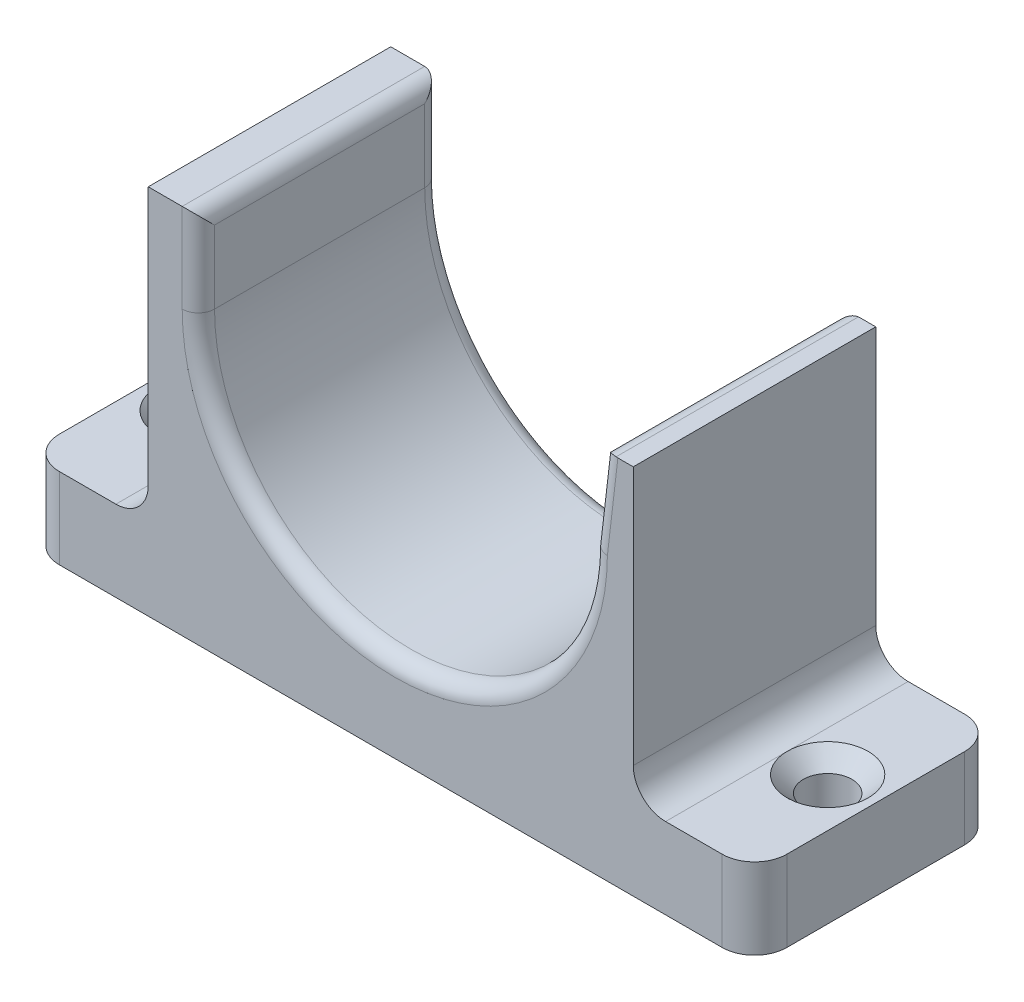
ISO-10303-21;
HEADER;
FILE_DESCRIPTION(('STEP AP214'),'2;1');
FILE_NAME('part.step','',(''),(''),'','','');
FILE_SCHEMA(('AUTOMOTIVE_DESIGN { 1 0 10303 214 1 1 1 1 }'));
ENDSEC;
DATA;
#1=APPLICATION_CONTEXT('core data for automotive mechanical design processes');
#2=APPLICATION_PROTOCOL_DEFINITION('international standard','automotive_design',2000,#1);
#3=PRODUCT_CONTEXT('',#1,'mechanical');
#4=PRODUCT('Part','Part','',(#3));
#5=PRODUCT_RELATED_PRODUCT_CATEGORY('part','',(#4));
#6=PRODUCT_DEFINITION_FORMATION('','',#4);
#7=PRODUCT_DEFINITION_CONTEXT('part definition',#1,'design');
#8=PRODUCT_DEFINITION('design','',#6,#7);
#9=PRODUCT_DEFINITION_SHAPE('','',#8);
#10=(LENGTH_UNIT() NAMED_UNIT(*) SI_UNIT(.MILLI.,.METRE.));
#11=(NAMED_UNIT(*) PLANE_ANGLE_UNIT() SI_UNIT($,.RADIAN.));
#12=(NAMED_UNIT(*) SI_UNIT($,.STERADIAN.) SOLID_ANGLE_UNIT());
#13=UNCERTAINTY_MEASURE_WITH_UNIT(LENGTH_MEASURE(1.E-05),#10,'distance_accuracy_value','');
#14=(GEOMETRIC_REPRESENTATION_CONTEXT(3) GLOBAL_UNCERTAINTY_ASSIGNED_CONTEXT((#13)) GLOBAL_UNIT_ASSIGNED_CONTEXT((#10,
#11,#12)) REPRESENTATION_CONTEXT('',''));
#15=CARTESIAN_POINT('',(0.,0.,0.));
#16=DIRECTION('',(0.,0.,1.));
#17=DIRECTION('',(1.,0.,0.));
#18=AXIS2_PLACEMENT_3D('',#15,#16,#17);
#19=CARTESIAN_POINT('',(22.7507170258644,17.5,-20.));
#20=DIRECTION('',(0.,0.,1.));
#21=DIRECTION('',(1.,0.,0.));
#22=AXIS2_PLACEMENT_3D('',#19,#20,#21);
#23=CYLINDRICAL_SURFACE('',#22,12.15);
#24=DIRECTION('',(0.,0.,1.));
#25=VECTOR('',#24,1.);
#26=CARTESIAN_POINT('',(10.6007170258644,17.5,-20.));
#27=LINE('',#26,#25);
#28=CARTESIAN_POINT('',(10.6007170258644,17.5,-1.));
#29=VERTEX_POINT('',#28);
#30=CARTESIAN_POINT('',(10.6007170258644,17.5,-14.));
#31=VERTEX_POINT('',#30);
#32=EDGE_CURVE('E331',#29,#31,#27,.F.);
#33=ORIENTED_EDGE('',*,*,#32,.F.);
#34=CARTESIAN_POINT('',(22.7507170258644,17.5,-1.));
#35=DIRECTION('',(0.,0.,-1.));
#36=DIRECTION('',(-1.,0.,0.));
#37=AXIS2_PLACEMENT_3D('',#34,#35,#36);
#38=CIRCLE('',#37,12.15);
#39=CARTESIAN_POINT('',(34.9007170258644,17.5000000000001,-1.));
#40=VERTEX_POINT('',#39);
#41=EDGE_CURVE('E338',#29,#40,#38,.F.);
#42=ORIENTED_EDGE('',*,*,#41,.T.);
#43=DIRECTION('',(0.,0.,1.));
#44=VECTOR('',#43,1.);
#45=CARTESIAN_POINT('',(34.9007170258644,17.5000000000001,-20.));
#46=LINE('',#45,#44);
#47=CARTESIAN_POINT('',(34.9007170258644,17.5000000000001,-14.));
#48=VERTEX_POINT('',#47);
#49=EDGE_CURVE('E333',#40,#48,#46,.F.);
#50=ORIENTED_EDGE('',*,*,#49,.T.);
#51=CARTESIAN_POINT('',(22.7507170258644,17.5,-14.));
#52=DIRECTION('',(0.,0.,1.));
#53=DIRECTION('',(1.,0.,0.));
#54=AXIS2_PLACEMENT_3D('',#51,#52,#53);
#55=CIRCLE('',#54,12.15);
#56=EDGE_CURVE('E336',#48,#31,#55,.F.);
#57=ORIENTED_EDGE('',*,*,#56,.T.);
#58=EDGE_LOOP('',(#33,#42,#50,#57));
#59=FACE_BOUND('',#58,.T.);
#60=ADVANCED_FACE('F39',(#59),#23,.F.);
#61=CARTESIAN_POINT('',(0.,23.,0.));
#62=DIRECTION('',(0.,1.,0.));
#63=DIRECTION('',(0.,0.,1.));
#64=AXIS2_PLACEMENT_3D('',#61,#62,#63);
#65=PLANE('',#64);
#66=DIRECTION('',(1.,0.,0.));
#67=VECTOR('',#66,1.);
#68=CARTESIAN_POINT('',(7.5,23.,0.));
#69=LINE('',#68,#67);
#70=CARTESIAN_POINT('',(7.5,23.,0.));
#71=VERTEX_POINT('',#70);
#72=CARTESIAN_POINT('',(9.60071702586444,23.,0.));
#73=VERTEX_POINT('',#72);
#74=EDGE_CURVE('E575',#71,#73,#69,.T.);
#75=ORIENTED_EDGE('',*,*,#74,.T.);
#76=DIRECTION('',(0.,0.,1.));
#77=VECTOR('',#76,1.);
#78=CARTESIAN_POINT('',(9.60071702586444,23.,-15.));
#79=LINE('',#78,#77);
#80=CARTESIAN_POINT('',(9.60071702586444,23.,-15.));
#81=VERTEX_POINT('',#80);
#82=EDGE_CURVE('E11',#73,#81,#79,.F.);
#83=ORIENTED_EDGE('',*,*,#82,.T.);
#84=DIRECTION('',(-1.,0.,0.));
#85=VECTOR('',#84,1.);
#86=CARTESIAN_POINT('',(37.5,23.,-15.));
#87=LINE('',#86,#85);
#88=CARTESIAN_POINT('',(7.5,23.,-15.));
#89=VERTEX_POINT('',#88);
#90=EDGE_CURVE('E199',#81,#89,#87,.T.);
#91=ORIENTED_EDGE('',*,*,#90,.T.);
#92=DIRECTION('',(0.,0.,1.));
#93=VECTOR('',#92,1.);
#94=CARTESIAN_POINT('',(7.5,23.,-15.));
#95=LINE('',#94,#93);
#96=EDGE_CURVE('E203',#89,#71,#95,.T.);
#97=ORIENTED_EDGE('',*,*,#96,.T.);
#98=EDGE_LOOP('',(#75,#83,#91,#97));
#99=FACE_BOUND('',#98,.T.);
#100=ADVANCED_FACE('F202',(#99),#65,.T.);
#101=CARTESIAN_POINT('',(0.,5.,0.));
#102=DIRECTION('',(0.,-1.,0.));
#103=DIRECTION('',(0.,0.,-1.));
#104=AXIS2_PLACEMENT_3D('',#101,#102,#103);
#105=PLANE('',#104);
#106=DIRECTION('',(0.,0.,-1.));
#107=VECTOR('',#106,1.);
#108=CARTESIAN_POINT('',(39.5,5.,0.));
#109=LINE('',#108,#107);
#110=CARTESIAN_POINT('',(39.5,5.,-15.));
#111=VERTEX_POINT('',#110);
#112=CARTESIAN_POINT('',(39.5,5.,-7.52482662311037));
#113=VERTEX_POINT('',#112);
#114=EDGE_CURVE('E266',#111,#113,#109,.F.);
#115=ORIENTED_EDGE('',*,*,#114,.T.);
#116=CARTESIAN_POINT('',(42.,5.,-7.52482662311037));
#117=DIRECTION('',(0.,-1.,0.));
#118=DIRECTION('',(0.,0.,-1.));
#119=AXIS2_PLACEMENT_3D('',#116,#117,#118);
#120=CIRCLE('',#119,2.5);
#121=EDGE_CURVE('E322',#113,#113,#120,.T.);
#122=ORIENTED_EDGE('',*,*,#121,.T.);
#123=CARTESIAN_POINT('',(39.5,5.,0.));
#124=VERTEX_POINT('',#123);
#125=EDGE_CURVE('E265',#113,#124,#109,.F.);
#126=ORIENTED_EDGE('',*,*,#125,.T.);
#127=DIRECTION('',(1.,0.,0.));
#128=VECTOR('',#127,1.);
#129=CARTESIAN_POINT('',(45.,5.,0.));
#130=LINE('',#129,#128);
#131=CARTESIAN_POINT('',(43.,5.,0.));
#132=VERTEX_POINT('',#131);
#133=EDGE_CURVE('E240',#124,#132,#130,.T.);
#134=ORIENTED_EDGE('',*,*,#133,.T.);
#135=CARTESIAN_POINT('',(43.,5.,-2.));
#136=DIRECTION('',(0.,-1.,0.));
#137=DIRECTION('',(0.,0.,-1.));
#138=AXIS2_PLACEMENT_3D('',#135,#136,#137);
#139=CIRCLE('',#138,2.);
#140=CARTESIAN_POINT('',(45.,5.,-2.));
#141=VERTEX_POINT('',#140);
#142=EDGE_CURVE('E261',#132,#141,#139,.F.);
#143=ORIENTED_EDGE('',*,*,#142,.T.);
#144=DIRECTION('',(0.,0.,-1.));
#145=VECTOR('',#144,1.);
#146=CARTESIAN_POINT('',(45.,5.,-15.));
#147=LINE('',#146,#145);
#148=CARTESIAN_POINT('',(45.,5.,-13.));
#149=VERTEX_POINT('',#148);
#150=EDGE_CURVE('E239',#141,#149,#147,.T.);
#151=ORIENTED_EDGE('',*,*,#150,.T.);
#152=CARTESIAN_POINT('',(43.,5.,-13.));
#153=DIRECTION('',(0.,-1.,0.));
#154=DIRECTION('',(0.,0.,-1.));
#155=AXIS2_PLACEMENT_3D('',#152,#153,#154);
#156=CIRCLE('',#155,2.);
#157=CARTESIAN_POINT('',(43.,5.,-15.));
#158=VERTEX_POINT('',#157);
#159=EDGE_CURVE('E263',#149,#158,#156,.F.);
#160=ORIENTED_EDGE('',*,*,#159,.T.);
#161=DIRECTION('',(-1.,0.,0.));
#162=VECTOR('',#161,1.);
#163=CARTESIAN_POINT('',(0.,5.,-15.));
#164=LINE('',#163,#162);
#165=EDGE_CURVE('E246',#158,#111,#164,.T.);
#166=ORIENTED_EDGE('',*,*,#165,.T.);
#167=EDGE_LOOP('',(#115,#122,#126,#134,#143,#151,#160,#166));
#168=FACE_BOUND('',#167,.T.);
#169=ADVANCED_FACE('F476',(#168),#105,.F.);
#170=DIRECTION('',(0.,0.,1.));
#171=VECTOR('',#170,1.);
#172=CARTESIAN_POINT('',(5.5,5.,-15.));
#173=LINE('',#172,#171);
#174=CARTESIAN_POINT('',(5.50000000000002,5.,0.));
#175=VERTEX_POINT('',#174);
#176=CARTESIAN_POINT('',(5.5,5.,-7.52482662311037));
#177=VERTEX_POINT('',#176);
#178=EDGE_CURVE('E298',#175,#177,#173,.F.);
#179=ORIENTED_EDGE('',*,*,#178,.T.);
#180=CARTESIAN_POINT('',(3.,5.,-7.52482662311037));
#181=DIRECTION('',(0.,-1.,0.));
#182=DIRECTION('',(0.,0.,-1.));
#183=AXIS2_PLACEMENT_3D('',#180,#181,#182);
#184=CIRCLE('',#183,2.5);
#185=EDGE_CURVE('E328',#177,#177,#184,.T.);
#186=ORIENTED_EDGE('',*,*,#185,.T.);
#187=CARTESIAN_POINT('',(5.5,5.,-15.));
#188=VERTEX_POINT('',#187);
#189=EDGE_CURVE('E297',#177,#188,#173,.F.);
#190=ORIENTED_EDGE('',*,*,#189,.T.);
#191=CARTESIAN_POINT('',(2.,5.,-15.));
#192=VERTEX_POINT('',#191);
#193=EDGE_CURVE('E243',#188,#192,#164,.T.);
#194=ORIENTED_EDGE('',*,*,#193,.T.);
#195=CARTESIAN_POINT('',(2.,5.,-13.));
#196=DIRECTION('',(0.,-1.,0.));
#197=DIRECTION('',(0.,0.,-1.));
#198=AXIS2_PLACEMENT_3D('',#195,#196,#197);
#199=CIRCLE('',#198,2.);
#200=CARTESIAN_POINT('',(0.,5.,-13.));
#201=VERTEX_POINT('',#200);
#202=EDGE_CURVE('E303',#192,#201,#199,.F.);
#203=ORIENTED_EDGE('',*,*,#202,.T.);
#204=DIRECTION('',(0.,0.,1.));
#205=VECTOR('',#204,1.);
#206=CARTESIAN_POINT('',(0.,5.,0.));
#207=LINE('',#206,#205);
#208=CARTESIAN_POINT('',(0.,5.,-2.));
#209=VERTEX_POINT('',#208);
#210=EDGE_CURVE('E247',#201,#209,#207,.T.);
#211=ORIENTED_EDGE('',*,*,#210,.T.);
#212=CARTESIAN_POINT('',(2.,5.,-2.));
#213=DIRECTION('',(0.,-1.,0.));
#214=DIRECTION('',(0.,0.,-1.));
#215=AXIS2_PLACEMENT_3D('',#212,#213,#214);
#216=CIRCLE('',#215,2.);
#217=CARTESIAN_POINT('',(2.00000000000002,5.,0.));
#218=VERTEX_POINT('',#217);
#219=EDGE_CURVE('E301',#209,#218,#216,.F.);
#220=ORIENTED_EDGE('',*,*,#219,.T.);
#221=EDGE_CURVE('E236',#218,#175,#130,.T.);
#222=ORIENTED_EDGE('',*,*,#221,.T.);
#223=EDGE_LOOP('',(#179,#186,#190,#194,#203,#211,#220,#222));
#224=FACE_BOUND('',#223,.T.);
#225=ADVANCED_FACE('F499',(#224),#105,.F.);
#226=CARTESIAN_POINT('',(45.,5.,0.));
#227=DIRECTION('',(0.,0.,-1.));
#228=DIRECTION('',(-1.,0.,0.));
#229=AXIS2_PLACEMENT_3D('',#226,#227,#228);
#230=PLANE('',#229);
#231=CARTESIAN_POINT('',(36.5490685316214,23.,0.));
#232=VERTEX_POINT('',#231);
#233=CARTESIAN_POINT('',(37.5,23.,0.));
#234=VERTEX_POINT('',#233);
#235=EDGE_CURVE('E221',#232,#234,#69,.T.);
#236=ORIENTED_EDGE('',*,*,#235,.F.);
#237=DIRECTION('',(0.115863649023973,0.993265128168129,0.));
#238=VECTOR('',#237,1.);
#239=CARTESIAN_POINT('',(34.5910172910963,6.21420020201986,0.));
#240=LINE('',#239,#238);
#241=CARTESIAN_POINT('',(35.9005834412089,17.4407272525104,0.));
#242=VERTEX_POINT('',#241);
#243=EDGE_CURVE('E346',#232,#242,#240,.F.);
#244=ORIENTED_EDGE('',*,*,#243,.T.);
#245=CARTESIAN_POINT('',(22.7507170258644,17.5,0.));
#246=DIRECTION('',(0.,0.,-1.));
#247=DIRECTION('',(-1.,0.,0.));
#248=AXIS2_PLACEMENT_3D('',#245,#246,#247);
#249=CIRCLE('',#248,13.15);
#250=CARTESIAN_POINT('',(9.60071702586444,17.5,0.));
#251=VERTEX_POINT('',#250);
#252=EDGE_CURVE('E343',#242,#251,#249,.T.);
#253=ORIENTED_EDGE('',*,*,#252,.T.);
#254=DIRECTION('',(0.,-1.,0.));
#255=VECTOR('',#254,1.);
#256=CARTESIAN_POINT('',(9.60071702586444,4.99999999999999,0.));
#257=LINE('',#256,#255);
#258=EDGE_CURVE('E341',#251,#73,#257,.F.);
#259=ORIENTED_EDGE('',*,*,#258,.T.);
#260=ORIENTED_EDGE('',*,*,#74,.F.);
#261=DIRECTION('',(0.,-1.,0.));
#262=VECTOR('',#261,1.);
#263=CARTESIAN_POINT('',(7.5,23.,0.));
#264=LINE('',#263,#262);
#265=CARTESIAN_POINT('',(7.5,7.,0.));
#266=VERTEX_POINT('',#265);
#267=EDGE_CURVE('E219',#71,#266,#264,.T.);
#268=ORIENTED_EDGE('',*,*,#267,.T.);
#269=CARTESIAN_POINT('',(5.5,7.,0.));
#270=DIRECTION('',(0.,0.,-1.));
#271=DIRECTION('',(-1.,0.,0.));
#272=AXIS2_PLACEMENT_3D('',#269,#270,#271);
#273=CIRCLE('',#272,2.);
#274=EDGE_CURVE('E311',#266,#175,#273,.T.);
#275=ORIENTED_EDGE('',*,*,#274,.T.);
#276=ORIENTED_EDGE('',*,*,#221,.F.);
#277=DIRECTION('',(0.,-1.,0.));
#278=VECTOR('',#277,1.);
#279=CARTESIAN_POINT('',(2.,5.,0.));
#280=LINE('',#279,#278);
#281=CARTESIAN_POINT('',(2.00000000000002,0.,0.));
#282=VERTEX_POINT('',#281);
#283=EDGE_CURVE('E287',#218,#282,#280,.T.);
#284=ORIENTED_EDGE('',*,*,#283,.T.);
#285=DIRECTION('',(1.,0.,0.));
#286=VECTOR('',#285,1.);
#287=CARTESIAN_POINT('',(45.,0.,0.));
#288=LINE('',#287,#286);
#289=CARTESIAN_POINT('',(43.,0.,0.));
#290=VERTEX_POINT('',#289);
#291=EDGE_CURVE('E227',#282,#290,#288,.T.);
#292=ORIENTED_EDGE('',*,*,#291,.T.);
#293=DIRECTION('',(0.,-1.,0.));
#294=VECTOR('',#293,1.);
#295=CARTESIAN_POINT('',(43.,5.,0.));
#296=LINE('',#295,#294);
#297=EDGE_CURVE('E290',#290,#132,#296,.F.);
#298=ORIENTED_EDGE('',*,*,#297,.T.);
#299=ORIENTED_EDGE('',*,*,#133,.F.);
#300=CARTESIAN_POINT('',(39.5,7.,0.));
#301=DIRECTION('',(0.,0.,-1.));
#302=DIRECTION('',(-1.,0.,0.));
#303=AXIS2_PLACEMENT_3D('',#300,#301,#302);
#304=CIRCLE('',#303,2.);
#305=CARTESIAN_POINT('',(37.5,7.,0.));
#306=VERTEX_POINT('',#305);
#307=EDGE_CURVE('E309',#124,#306,#304,.T.);
#308=ORIENTED_EDGE('',*,*,#307,.T.);
#309=DIRECTION('',(0.,-1.,0.));
#310=VECTOR('',#309,1.);
#311=CARTESIAN_POINT('',(37.5,23.,0.));
#312=LINE('',#311,#310);
#313=EDGE_CURVE('E232',#234,#306,#312,.T.);
#314=ORIENTED_EDGE('',*,*,#313,.F.);
#315=EDGE_LOOP('',(#236,#244,#253,#259,#260,#268,#275,#276,#284,#292,#298,#299,#308,#314));
#316=FACE_BOUND('',#315,.T.);
#317=ADVANCED_FACE('F436',(#316),#230,.F.);
#318=CARTESIAN_POINT('',(45.,5.,-15.));
#319=DIRECTION('',(-1.,0.,0.));
#320=DIRECTION('',(0.,0.,1.));
#321=AXIS2_PLACEMENT_3D('',#318,#319,#320);
#322=PLANE('',#321);
#323=DIRECTION('',(0.,0.,-1.));
#324=VECTOR('',#323,1.);
#325=CARTESIAN_POINT('',(45.,0.,-15.));
#326=LINE('',#325,#324);
#327=CARTESIAN_POINT('',(45.,0.,-2.));
#328=VERTEX_POINT('',#327);
#329=CARTESIAN_POINT('',(45.,0.,-13.));
#330=VERTEX_POINT('',#329);
#331=EDGE_CURVE('E230',#328,#330,#326,.T.);
#332=ORIENTED_EDGE('',*,*,#331,.T.);
#333=DIRECTION('',(0.,-1.,0.));
#334=VECTOR('',#333,1.);
#335=CARTESIAN_POINT('',(45.,5.,-13.));
#336=LINE('',#335,#334);
#337=EDGE_CURVE('E285',#330,#149,#336,.F.);
#338=ORIENTED_EDGE('',*,*,#337,.T.);
#339=ORIENTED_EDGE('',*,*,#150,.F.);
#340=DIRECTION('',(0.,-1.,0.));
#341=VECTOR('',#340,1.);
#342=CARTESIAN_POINT('',(45.,5.,-2.));
#343=LINE('',#342,#341);
#344=EDGE_CURVE('E282',#141,#328,#343,.T.);
#345=ORIENTED_EDGE('',*,*,#344,.T.);
#346=EDGE_LOOP('',(#332,#338,#339,#345));
#347=FACE_BOUND('',#346,.T.);
#348=ADVANCED_FACE('F510',(#347),#322,.F.);
#349=CARTESIAN_POINT('',(0.,5.,-15.));
#350=DIRECTION('',(0.,0.,1.));
#351=DIRECTION('',(1.,0.,0.));
#352=AXIS2_PLACEMENT_3D('',#349,#350,#351);
#353=PLANE('',#352);
#354=CARTESIAN_POINT('',(22.7507170258644,17.5,-15.));
#355=DIRECTION('',(0.,0.,1.));
#356=DIRECTION('',(1.,0.,0.));
#357=AXIS2_PLACEMENT_3D('',#354,#355,#356);
#358=CIRCLE('',#357,13.15);
#359=CARTESIAN_POINT('',(9.60071702586442,17.5,-15.));
#360=VERTEX_POINT('',#359);
#361=CARTESIAN_POINT('',(35.9005834412089,17.4407272525104,-15.));
#362=VERTEX_POINT('',#361);
#363=EDGE_CURVE('E348',#360,#362,#358,.T.);
#364=ORIENTED_EDGE('',*,*,#363,.T.);
#365=DIRECTION('',(0.115863649023973,0.993265128168129,0.));
#366=VECTOR('',#365,1.);
#367=CARTESIAN_POINT('',(33.9869199586646,1.03545070311778,-15.));
#368=LINE('',#367,#366);
#369=CARTESIAN_POINT('',(36.5490685316214,23.,-15.));
#370=VERTEX_POINT('',#369);
#371=EDGE_CURVE('E352',#362,#370,#368,.T.);
#372=ORIENTED_EDGE('',*,*,#371,.T.);
#373=CARTESIAN_POINT('',(37.5,23.,-15.));
#374=VERTEX_POINT('',#373);
#375=EDGE_CURVE('E209',#374,#370,#87,.T.);
#376=ORIENTED_EDGE('',*,*,#375,.F.);
#377=DIRECTION('',(0.,-1.,0.));
#378=VECTOR('',#377,1.);
#379=CARTESIAN_POINT('',(37.5,23.,-15.));
#380=LINE('',#379,#378);
#381=CARTESIAN_POINT('',(37.5,7.,-15.));
#382=VERTEX_POINT('',#381);
#383=EDGE_CURVE('E578',#374,#382,#380,.T.);
#384=ORIENTED_EDGE('',*,*,#383,.T.);
#385=CARTESIAN_POINT('',(39.5,7.,-15.));
#386=DIRECTION('',(0.,0.,1.));
#387=DIRECTION('',(1.,0.,0.));
#388=AXIS2_PLACEMENT_3D('',#385,#386,#387);
#389=CIRCLE('',#388,2.);
#390=EDGE_CURVE('E307',#382,#111,#389,.T.);
#391=ORIENTED_EDGE('',*,*,#390,.T.);
#392=ORIENTED_EDGE('',*,*,#165,.F.);
#393=DIRECTION('',(0.,-1.,0.));
#394=VECTOR('',#393,1.);
#395=CARTESIAN_POINT('',(43.,5.,-15.));
#396=LINE('',#395,#394);
#397=CARTESIAN_POINT('',(43.,0.,-15.));
#398=VERTEX_POINT('',#397);
#399=EDGE_CURVE('E271',#158,#398,#396,.T.);
#400=ORIENTED_EDGE('',*,*,#399,.T.);
#401=DIRECTION('',(-1.,0.,0.));
#402=VECTOR('',#401,1.);
#403=CARTESIAN_POINT('',(0.,0.,-15.));
#404=LINE('',#403,#402);
#405=CARTESIAN_POINT('',(2.,0.,-15.));
#406=VERTEX_POINT('',#405);
#407=EDGE_CURVE('E253',#398,#406,#404,.T.);
#408=ORIENTED_EDGE('',*,*,#407,.T.);
#409=DIRECTION('',(0.,-1.,0.));
#410=VECTOR('',#409,1.);
#411=CARTESIAN_POINT('',(2.,5.,-15.));
#412=LINE('',#411,#410);
#413=EDGE_CURVE('E269',#406,#192,#412,.F.);
#414=ORIENTED_EDGE('',*,*,#413,.T.);
#415=ORIENTED_EDGE('',*,*,#193,.F.);
#416=CARTESIAN_POINT('',(5.5,7.,-15.));
#417=DIRECTION('',(0.,0.,1.));
#418=DIRECTION('',(1.,0.,0.));
#419=AXIS2_PLACEMENT_3D('',#416,#417,#418);
#420=CIRCLE('',#419,2.);
#421=CARTESIAN_POINT('',(7.5,7.,-15.));
#422=VERTEX_POINT('',#421);
#423=EDGE_CURVE('E226',#188,#422,#420,.T.);
#424=ORIENTED_EDGE('',*,*,#423,.T.);
#425=DIRECTION('',(0.,-1.,0.));
#426=VECTOR('',#425,1.);
#427=CARTESIAN_POINT('',(7.5,23.,-15.));
#428=LINE('',#427,#426);
#429=EDGE_CURVE('E216',#89,#422,#428,.T.);
#430=ORIENTED_EDGE('',*,*,#429,.F.);
#431=ORIENTED_EDGE('',*,*,#90,.F.);
#432=DIRECTION('',(0.,-1.,0.));
#433=VECTOR('',#432,1.);
#434=CARTESIAN_POINT('',(9.60071702586444,5.,-15.));
#435=LINE('',#434,#433);
#436=EDGE_CURVE('E350',#81,#360,#435,.T.);
#437=ORIENTED_EDGE('',*,*,#436,.T.);
#438=EDGE_LOOP('',(#364,#372,#376,#384,#391,#392,#400,#408,#414,#415,#424,#430,#431,#437));
#439=FACE_BOUND('',#438,.T.);
#440=ADVANCED_FACE('F223',(#439),#353,.F.);
#441=CARTESIAN_POINT('',(0.,5.,0.));
#442=DIRECTION('',(1.,0.,0.));
#443=DIRECTION('',(0.,0.,-1.));
#444=AXIS2_PLACEMENT_3D('',#441,#442,#443);
#445=PLANE('',#444);
#446=ORIENTED_EDGE('',*,*,#210,.F.);
#447=DIRECTION('',(0.,-1.,0.));
#448=VECTOR('',#447,1.);
#449=CARTESIAN_POINT('',(0.,5.,-13.));
#450=LINE('',#449,#448);
#451=CARTESIAN_POINT('',(0.,0.,-13.));
#452=VERTEX_POINT('',#451);
#453=EDGE_CURVE('E294',#201,#452,#450,.T.);
#454=ORIENTED_EDGE('',*,*,#453,.T.);
#455=DIRECTION('',(0.,0.,1.));
#456=VECTOR('',#455,1.);
#457=CARTESIAN_POINT('',(0.,0.,0.));
#458=LINE('',#457,#456);
#459=CARTESIAN_POINT('',(0.,0.,-2.));
#460=VERTEX_POINT('',#459);
#461=EDGE_CURVE('E256',#452,#460,#458,.T.);
#462=ORIENTED_EDGE('',*,*,#461,.T.);
#463=DIRECTION('',(0.,-1.,0.));
#464=VECTOR('',#463,1.);
#465=CARTESIAN_POINT('',(0.,5.,-2.));
#466=LINE('',#465,#464);
#467=EDGE_CURVE('E292',#460,#209,#466,.F.);
#468=ORIENTED_EDGE('',*,*,#467,.T.);
#469=EDGE_LOOP('',(#446,#454,#462,#468));
#470=FACE_BOUND('',#469,.T.);
#471=ADVANCED_FACE('F503',(#470),#445,.F.);
#472=CARTESIAN_POINT('',(0.,0.,0.));
#473=DIRECTION('',(0.,-1.,0.));
#474=DIRECTION('',(0.,0.,-1.));
#475=AXIS2_PLACEMENT_3D('',#472,#473,#474);
#476=PLANE('',#475);
#477=CARTESIAN_POINT('',(3.,0.,-7.52482662311037));
#478=DIRECTION('',(0.,-1.,0.));
#479=DIRECTION('',(0.,0.,-1.));
#480=AXIS2_PLACEMENT_3D('',#477,#478,#479);
#481=CIRCLE('',#480,1.5);
#482=CARTESIAN_POINT('',(3.,0.,-9.02482662311037));
#483=VERTEX_POINT('',#482);
#484=EDGE_CURVE('E210',#483,#483,#481,.T.);
#485=ORIENTED_EDGE('',*,*,#484,.F.);
#486=EDGE_LOOP('',(#485));
#487=FACE_BOUND('',#486,.T.);
#488=CARTESIAN_POINT('',(42.,0.,-7.52482662311037));
#489=DIRECTION('',(0.,-1.,0.));
#490=DIRECTION('',(0.,0.,-1.));
#491=AXIS2_PLACEMENT_3D('',#488,#489,#490);
#492=CIRCLE('',#491,1.5);
#493=CARTESIAN_POINT('',(42.,0.,-9.02482662311037));
#494=VERTEX_POINT('',#493);
#495=EDGE_CURVE('E315',#494,#494,#492,.T.);
#496=ORIENTED_EDGE('',*,*,#495,.F.);
#497=EDGE_LOOP('',(#496));
#498=FACE_BOUND('',#497,.T.);
#499=ORIENTED_EDGE('',*,*,#407,.F.);
#500=CARTESIAN_POINT('',(43.,0.,-13.));
#501=DIRECTION('',(0.,-1.,0.));
#502=DIRECTION('',(0.,0.,-1.));
#503=AXIS2_PLACEMENT_3D('',#500,#501,#502);
#504=CIRCLE('',#503,2.);
#505=EDGE_CURVE('E280',#398,#330,#504,.T.);
#506=ORIENTED_EDGE('',*,*,#505,.T.);
#507=ORIENTED_EDGE('',*,*,#331,.F.);
#508=CARTESIAN_POINT('',(43.,0.,-2.));
#509=DIRECTION('',(0.,-1.,0.));
#510=DIRECTION('',(0.,0.,-1.));
#511=AXIS2_PLACEMENT_3D('',#508,#509,#510);
#512=CIRCLE('',#511,2.);
#513=EDGE_CURVE('E278',#328,#290,#512,.T.);
#514=ORIENTED_EDGE('',*,*,#513,.T.);
#515=ORIENTED_EDGE('',*,*,#291,.F.);
#516=CARTESIAN_POINT('',(2.,0.,-2.));
#517=DIRECTION('',(0.,-1.,0.));
#518=DIRECTION('',(0.,0.,-1.));
#519=AXIS2_PLACEMENT_3D('',#516,#517,#518);
#520=CIRCLE('',#519,2.);
#521=EDGE_CURVE('E274',#282,#460,#520,.T.);
#522=ORIENTED_EDGE('',*,*,#521,.T.);
#523=ORIENTED_EDGE('',*,*,#461,.F.);
#524=CARTESIAN_POINT('',(2.,0.,-13.));
#525=DIRECTION('',(0.,-1.,0.));
#526=DIRECTION('',(0.,0.,-1.));
#527=AXIS2_PLACEMENT_3D('',#524,#525,#526);
#528=CIRCLE('',#527,2.);
#529=EDGE_CURVE('E276',#452,#406,#528,.T.);
#530=ORIENTED_EDGE('',*,*,#529,.T.);
#531=EDGE_LOOP('',(#499,#506,#507,#514,#515,#522,#523,#530));
#532=FACE_BOUND('',#531,.T.);
#533=ADVANCED_FACE('F496',(#487,#498,#532),#476,.T.);
#534=CARTESIAN_POINT('',(7.5,23.,-15.));
#535=DIRECTION('',(1.,0.,0.));
#536=DIRECTION('',(0.,0.,-1.));
#537=AXIS2_PLACEMENT_3D('',#534,#535,#536);
#538=PLANE('',#537);
#539=ORIENTED_EDGE('',*,*,#429,.T.);
#540=DIRECTION('',(0.,0.,1.));
#541=VECTOR('',#540,1.);
#542=CARTESIAN_POINT('',(7.5,7.,0.));
#543=LINE('',#542,#541);
#544=EDGE_CURVE('E305',#422,#266,#543,.T.);
#545=ORIENTED_EDGE('',*,*,#544,.T.);
#546=ORIENTED_EDGE('',*,*,#267,.F.);
#547=ORIENTED_EDGE('',*,*,#96,.F.);
#548=EDGE_LOOP('',(#539,#545,#546,#547));
#549=FACE_BOUND('',#548,.T.);
#550=ADVANCED_FACE('F214',(#549),#538,.F.);
#551=CARTESIAN_POINT('',(37.5,23.,0.));
#552=DIRECTION('',(-1.,0.,0.));
#553=DIRECTION('',(0.,0.,1.));
#554=AXIS2_PLACEMENT_3D('',#551,#552,#553);
#555=PLANE('',#554);
#556=ORIENTED_EDGE('',*,*,#313,.T.);
#557=DIRECTION('',(0.,0.,-1.));
#558=VECTOR('',#557,1.);
#559=CARTESIAN_POINT('',(37.5,7.,-15.));
#560=LINE('',#559,#558);
#561=EDGE_CURVE('E249',#306,#382,#560,.T.);
#562=ORIENTED_EDGE('',*,*,#561,.T.);
#563=ORIENTED_EDGE('',*,*,#383,.F.);
#564=DIRECTION('',(0.,0.,-1.));
#565=VECTOR('',#564,1.);
#566=CARTESIAN_POINT('',(37.5,23.,0.));
#567=LINE('',#566,#565);
#568=EDGE_CURVE('E576',#234,#374,#567,.T.);
#569=ORIENTED_EDGE('',*,*,#568,.F.);
#570=EDGE_LOOP('',(#556,#562,#563,#569));
#571=FACE_BOUND('',#570,.T.);
#572=ADVANCED_FACE('F490',(#571),#555,.F.);
#573=ORIENTED_EDGE('',*,*,#375,.T.);
#574=CARTESIAN_POINT('',(36.5490685316214,23.,-14.));
#575=DIRECTION('',(0.,1.,0.));
#576=DIRECTION('',(1.,0.,0.));
#577=AXIS2_PLACEMENT_3D('',#574,#575,#576);
#578=ELLIPSE('',#577,1.00678053788548,1.);
#579=CARTESIAN_POINT('',(36.4324192647356,23.,-14.9932651281681));
#580=VERTEX_POINT('',#579);
#581=EDGE_CURVE('E358',#370,#580,#578,.T.);
#582=ORIENTED_EDGE('',*,*,#581,.T.);
#583=DIRECTION('',(0.,0.,1.));
#584=VECTOR('',#583,1.);
#585=CARTESIAN_POINT('',(36.4324192647356,23.,0.));
#586=LINE('',#585,#584);
#587=CARTESIAN_POINT('',(36.4324192647356,23.,-0.00673487183187152));
#588=VERTEX_POINT('',#587);
#589=EDGE_CURVE('E354',#580,#588,#586,.T.);
#590=ORIENTED_EDGE('',*,*,#589,.T.);
#591=CARTESIAN_POINT('',(36.5490685316214,23.,-1.));
#592=DIRECTION('',(0.,1.,0.));
#593=DIRECTION('',(1.,0.,0.));
#594=AXIS2_PLACEMENT_3D('',#591,#592,#593);
#595=ELLIPSE('',#594,1.00678053788548,1.);
#596=EDGE_CURVE('E356',#588,#232,#595,.T.);
#597=ORIENTED_EDGE('',*,*,#596,.T.);
#598=ORIENTED_EDGE('',*,*,#235,.T.);
#599=ORIENTED_EDGE('',*,*,#568,.T.);
#600=EDGE_LOOP('',(#573,#582,#590,#597,#598,#599));
#601=FACE_BOUND('',#600,.T.);
#602=ADVANCED_FACE('F454',(#601),#65,.T.);
#603=CARTESIAN_POINT('',(39.5,7.,0.));
#604=DIRECTION('',(0.,0.,1.));
#605=DIRECTION('',(1.,0.,0.));
#606=AXIS2_PLACEMENT_3D('',#603,#604,#605);
#607=CYLINDRICAL_SURFACE('',#606,2.);
#608=ORIENTED_EDGE('',*,*,#307,.F.);
#609=ORIENTED_EDGE('',*,*,#125,.F.);
#610=ORIENTED_EDGE('',*,*,#114,.F.);
#611=ORIENTED_EDGE('',*,*,#390,.F.);
#612=ORIENTED_EDGE('',*,*,#561,.F.);
#613=EDGE_LOOP('',(#608,#609,#610,#611,#612));
#614=FACE_BOUND('',#613,.T.);
#615=ADVANCED_FACE('F489',(#614),#607,.F.);
#616=CARTESIAN_POINT('',(43.,5.,-13.));
#617=DIRECTION('',(0.,-1.,0.));
#618=DIRECTION('',(0.,0.,-1.));
#619=AXIS2_PLACEMENT_3D('',#616,#617,#618);
#620=CYLINDRICAL_SURFACE('',#619,2.);
#621=ORIENTED_EDGE('',*,*,#159,.F.);
#622=ORIENTED_EDGE('',*,*,#337,.F.);
#623=ORIENTED_EDGE('',*,*,#505,.F.);
#624=ORIENTED_EDGE('',*,*,#399,.F.);
#625=EDGE_LOOP('',(#621,#622,#623,#624));
#626=FACE_BOUND('',#625,.T.);
#627=ADVANCED_FACE('F518',(#626),#620,.T.);
#628=CARTESIAN_POINT('',(43.,5.,-2.));
#629=DIRECTION('',(0.,-1.,0.));
#630=DIRECTION('',(0.,0.,-1.));
#631=AXIS2_PLACEMENT_3D('',#628,#629,#630);
#632=CYLINDRICAL_SURFACE('',#631,2.);
#633=ORIENTED_EDGE('',*,*,#142,.F.);
#634=ORIENTED_EDGE('',*,*,#297,.F.);
#635=ORIENTED_EDGE('',*,*,#513,.F.);
#636=ORIENTED_EDGE('',*,*,#344,.F.);
#637=EDGE_LOOP('',(#633,#634,#635,#636));
#638=FACE_BOUND('',#637,.T.);
#639=ADVANCED_FACE('F522',(#638),#632,.T.);
#640=CARTESIAN_POINT('',(2.,5.,-13.));
#641=DIRECTION('',(0.,-1.,0.));
#642=DIRECTION('',(0.,0.,-1.));
#643=AXIS2_PLACEMENT_3D('',#640,#641,#642);
#644=CYLINDRICAL_SURFACE('',#643,2.);
#645=ORIENTED_EDGE('',*,*,#202,.F.);
#646=ORIENTED_EDGE('',*,*,#413,.F.);
#647=ORIENTED_EDGE('',*,*,#529,.F.);
#648=ORIENTED_EDGE('',*,*,#453,.F.);
#649=EDGE_LOOP('',(#645,#646,#647,#648));
#650=FACE_BOUND('',#649,.T.);
#651=ADVANCED_FACE('F526',(#650),#644,.T.);
#652=CARTESIAN_POINT('',(2.,5.,-2.));
#653=DIRECTION('',(0.,-1.,0.));
#654=DIRECTION('',(0.,0.,-1.));
#655=AXIS2_PLACEMENT_3D('',#652,#653,#654);
#656=CYLINDRICAL_SURFACE('',#655,2.);
#657=ORIENTED_EDGE('',*,*,#219,.F.);
#658=ORIENTED_EDGE('',*,*,#467,.F.);
#659=ORIENTED_EDGE('',*,*,#521,.F.);
#660=ORIENTED_EDGE('',*,*,#283,.F.);
#661=EDGE_LOOP('',(#657,#658,#659,#660));
#662=FACE_BOUND('',#661,.T.);
#663=ADVANCED_FACE('F530',(#662),#656,.T.);
#664=CARTESIAN_POINT('',(5.5,7.,-15.));
#665=DIRECTION('',(0.,0.,-1.));
#666=DIRECTION('',(-1.,0.,0.));
#667=AXIS2_PLACEMENT_3D('',#664,#665,#666);
#668=CYLINDRICAL_SURFACE('',#667,2.);
#669=ORIENTED_EDGE('',*,*,#423,.F.);
#670=ORIENTED_EDGE('',*,*,#189,.F.);
#671=ORIENTED_EDGE('',*,*,#178,.F.);
#672=ORIENTED_EDGE('',*,*,#274,.F.);
#673=ORIENTED_EDGE('',*,*,#544,.F.);
#674=EDGE_LOOP('',(#669,#670,#671,#672,#673));
#675=FACE_BOUND('',#674,.T.);
#676=ADVANCED_FACE('F485',(#675),#668,.F.);
#677=CARTESIAN_POINT('',(42.,-15.,-7.52482662311037));
#678=DIRECTION('',(0.,1.,0.));
#679=DIRECTION('',(0.,0.,1.));
#680=AXIS2_PLACEMENT_3D('',#677,#678,#679);
#681=CYLINDRICAL_SURFACE('',#680,1.5);
#682=CARTESIAN_POINT('',(42.,4.00000000000001,-7.52482662311037));
#683=DIRECTION('',(0.,-1.,0.));
#684=DIRECTION('',(0.,0.,-1.));
#685=AXIS2_PLACEMENT_3D('',#682,#683,#684);
#686=CIRCLE('',#685,1.5);
#687=CARTESIAN_POINT('',(42.,4.00000000000001,-9.02482662311037));
#688=VERTEX_POINT('',#687);
#689=EDGE_CURVE('E314',#688,#688,#686,.F.);
#690=ORIENTED_EDGE('',*,*,#689,.T.);
#691=EDGE_LOOP('',(#690));
#692=FACE_BOUND('',#691,.T.);
#693=ORIENTED_EDGE('',*,*,#495,.T.);
#694=EDGE_LOOP('',(#693));
#695=FACE_BOUND('',#694,.T.);
#696=ADVANCED_FACE('F482',(#692,#695),#681,.F.);
#697=CARTESIAN_POINT('',(3.,-15.,-7.52482662311037));
#698=DIRECTION('',(0.,1.,0.));
#699=DIRECTION('',(0.,0.,1.));
#700=AXIS2_PLACEMENT_3D('',#697,#698,#699);
#701=CYLINDRICAL_SURFACE('',#700,1.5);
#702=CARTESIAN_POINT('',(3.,4.,-7.52482662311037));
#703=DIRECTION('',(0.,-1.,0.));
#704=DIRECTION('',(0.,0.,-1.));
#705=AXIS2_PLACEMENT_3D('',#702,#703,#704);
#706=CIRCLE('',#705,1.5);
#707=CARTESIAN_POINT('',(3.,4.,-9.02482662311037));
#708=VERTEX_POINT('',#707);
#709=EDGE_CURVE('E325',#708,#708,#706,.F.);
#710=ORIENTED_EDGE('',*,*,#709,.T.);
#711=EDGE_LOOP('',(#710));
#712=FACE_BOUND('',#711,.T.);
#713=ORIENTED_EDGE('',*,*,#484,.T.);
#714=EDGE_LOOP('',(#713));
#715=FACE_BOUND('',#714,.T.);
#716=ADVANCED_FACE('F479',(#712,#715),#701,.F.);
#717=CARTESIAN_POINT('',(42.,4.00000000000001,-7.52482662311037));
#718=DIRECTION('',(0.,1.,0.));
#719=DIRECTION('',(0.,0.,1.));
#720=AXIS2_PLACEMENT_3D('',#717,#718,#719);
#721=CONICAL_SURFACE('',#720,1.5,0.78539816339745);
#722=ORIENTED_EDGE('',*,*,#121,.F.);
#723=EDGE_LOOP('',(#722));
#724=FACE_BOUND('',#723,.T.);
#725=ORIENTED_EDGE('',*,*,#689,.F.);
#726=EDGE_LOOP('',(#725));
#727=FACE_BOUND('',#726,.T.);
#728=ADVANCED_FACE('F469',(#724,#727),#721,.F.);
#729=CARTESIAN_POINT('',(3.,4.,-7.52482662311037));
#730=DIRECTION('',(0.,1.,0.));
#731=DIRECTION('',(0.,0.,1.));
#732=AXIS2_PLACEMENT_3D('',#729,#730,#731);
#733=CONICAL_SURFACE('',#732,1.5,0.78539816339745);
#734=ORIENTED_EDGE('',*,*,#185,.F.);
#735=EDGE_LOOP('',(#734));
#736=FACE_BOUND('',#735,.T.);
#737=ORIENTED_EDGE('',*,*,#709,.F.);
#738=EDGE_LOOP('',(#737));
#739=FACE_BOUND('',#738,.T.);
#740=ADVANCED_FACE('F462',(#736,#739),#733,.F.);
#741=CARTESIAN_POINT('',(10.6007170258644,0.,-20.));
#742=DIRECTION('',(-1.,0.,0.));
#743=DIRECTION('',(0.,-1.,0.));
#744=AXIS2_PLACEMENT_3D('',#741,#742,#743);
#745=PLANE('',#744);
#746=ORIENTED_EDGE('',*,*,#32,.T.);
#747=DIRECTION('',(0.,-1.,0.));
#748=VECTOR('',#747,1.);
#749=CARTESIAN_POINT('',(10.6007170258644,0.,-14.));
#750=LINE('',#749,#748);
#751=CARTESIAN_POINT('',(10.6007170258644,22.,-14.));
#752=VERTEX_POINT('',#751);
#753=EDGE_CURVE('E48',#31,#752,#750,.F.);
#754=ORIENTED_EDGE('',*,*,#753,.T.);
#755=DIRECTION('',(0.,0.,1.));
#756=VECTOR('',#755,1.);
#757=CARTESIAN_POINT('',(10.6007170258644,22.,0.));
#758=LINE('',#757,#756);
#759=CARTESIAN_POINT('',(10.6007170258644,22.,-1.));
#760=VERTEX_POINT('',#759);
#761=EDGE_CURVE('E56',#752,#760,#758,.T.);
#762=ORIENTED_EDGE('',*,*,#761,.T.);
#763=DIRECTION('',(0.,-1.,0.));
#764=VECTOR('',#763,1.);
#765=CARTESIAN_POINT('',(10.6007170258644,0.,-1.));
#766=LINE('',#765,#764);
#767=EDGE_CURVE('E367',#760,#29,#766,.T.);
#768=ORIENTED_EDGE('',*,*,#767,.T.);
#769=EDGE_LOOP('',(#746,#754,#762,#768));
#770=FACE_BOUND('',#769,.T.);
#771=ADVANCED_FACE('F460',(#770),#745,.F.);
#772=CARTESIAN_POINT('',(32.4182382195073,-3.7815637220325,-20.));
#773=DIRECTION('',(0.993265128168129,-0.115863649023973,0.));
#774=DIRECTION('',(0.115863649023973,0.993265128168129,0.));
#775=AXIS2_PLACEMENT_3D('',#772,#773,#774);
#776=PLANE('',#775);
#777=DIRECTION('',(0.,0.,1.));
#778=VECTOR('',#777,1.);
#779=CARTESIAN_POINT('',(35.4391541365675,22.115863649024,-15.));
#780=LINE('',#779,#778);
#781=CARTESIAN_POINT('',(35.4391541365675,22.115863649024,-1.));
#782=VERTEX_POINT('',#781);
#783=CARTESIAN_POINT('',(35.4391541365675,22.115863649024,-14.));
#784=VERTEX_POINT('',#783);
#785=EDGE_CURVE('E360',#782,#784,#780,.F.);
#786=ORIENTED_EDGE('',*,*,#785,.T.);
#787=DIRECTION('',(0.115863649023973,0.993265128168129,0.));
#788=VECTOR('',#787,1.);
#789=CARTESIAN_POINT('',(32.4182382195073,-3.7815637220325,-14.));
#790=LINE('',#789,#788);
#791=EDGE_CURVE('E364',#784,#48,#790,.F.);
#792=ORIENTED_EDGE('',*,*,#791,.T.);
#793=ORIENTED_EDGE('',*,*,#49,.F.);
#794=DIRECTION('',(0.115863649023973,0.993265128168129,0.));
#795=VECTOR('',#794,1.);
#796=CARTESIAN_POINT('',(32.4182382195073,-3.7815637220325,-1.));
#797=LINE('',#796,#795);
#798=EDGE_CURVE('E362',#40,#782,#797,.T.);
#799=ORIENTED_EDGE('',*,*,#798,.T.);
#800=EDGE_LOOP('',(#786,#792,#793,#799));
#801=FACE_BOUND('',#800,.T.);
#802=ADVANCED_FACE('F404',(#801),#776,.F.);
#803=CARTESIAN_POINT('',(22.7507170258644,17.5,-14.));
#804=DIRECTION('',(0.,0.,1.));
#805=DIRECTION('',(1.,0.,0.));
#806=AXIS2_PLACEMENT_3D('',#803,#804,#805);
#807=TOROIDAL_SURFACE('',#806,13.15,1.);
#808=CARTESIAN_POINT('',(34.9007170258644,17.5000000000001,-14.));
#809=CARTESIAN_POINT('',(34.9007171861612,17.499999974253,-14.0280997479359));
#810=CARTESIAN_POINT('',(34.9019021651933,17.4999311125057,-14.0561860207149));
#811=CARTESIAN_POINT('',(34.9066293473917,17.4996562991534,-14.1121573288653));
#812=CARTESIAN_POINT('',(34.9101714295745,17.4994503545845,-14.1400423744909));
#813=CARTESIAN_POINT('',(34.9242995301181,17.4986286528231,-14.2230483253297));
#814=CARTESIAN_POINT('',(34.9383874959628,17.4978090229959,-14.2776127504284));
#815=CARTESIAN_POINT('',(34.9755066109043,17.4956463763725,-14.383595441439));
#816=CARTESIAN_POINT('',(34.9985418753112,17.4943031187326,-14.4350122469873));
#817=CARTESIAN_POINT('',(35.0528925494237,17.4911276566521,-14.5332420776714));
#818=CARTESIAN_POINT('',(35.0842060984355,17.4892955620857,-14.5800561341183));
#819=CARTESIAN_POINT('',(35.1542462241373,17.485188046676,-14.6677937186967));
#820=CARTESIAN_POINT('',(35.1929780507129,17.4829123118498,-14.7087130389969));
#821=CARTESIAN_POINT('',(35.2767548086662,17.4779767242939,-14.7834845079078));
#822=CARTESIAN_POINT('',(35.3218019371797,17.4753167378707,-14.8173341866946));
#823=CARTESIAN_POINT('',(35.4170012187991,17.4696789433427,-14.8770515375274));
#824=CARTESIAN_POINT('',(35.467162766974,17.4667005498265,-14.9029041546702));
#825=CARTESIAN_POINT('',(35.571080119855,17.4605114508457,-14.9457974393008));
#826=CARTESIAN_POINT('',(35.6248326016937,17.4573009599322,-14.9628461293551));
#827=CARTESIAN_POINT('',(35.7127636122125,17.4520328715018,-14.9827863812925));
#828=CARTESIAN_POINT('',(35.7463112899445,17.4500193372632,-14.9886092389128));
#829=CARTESIAN_POINT('',(35.8137913604207,17.4459617216029,-14.9968023871706));
#830=CARTESIAN_POINT('',(35.8477231049621,17.4439176902045,-14.9991778127369));
#831=CARTESIAN_POINT('',(35.8879728690717,17.4414886684003,-14.9999404575455));
#832=CARTESIAN_POINT('',(35.8942785895734,17.4411079983577,-15.0000001590328));
#833=CARTESIAN_POINT('',(35.9005834412089,17.4407272525104,-15.));
#834=B_SPLINE_CURVE_WITH_KNOTS('',3,(#808,#809,#810,#811,#812,#813,#814,#815,#816,#817,#818,
#819,#820,#821,#822,#823,#824,#825,#826,#827,#828,#829,#830,#831,#832,#833),.UNSPECIFIED.,.F.,
.F.,(4,2,2,2,2,2,2,2,2,2,2,2,4),(0.,0.0842474225994864,0.168490521341634,0.336702143730287,
0.504991226853263,0.67324251608196,0.841613319006353,1.0100428452999,1.1787875462935,
1.3473782063532,1.44955400265897,1.55157745199272,1.57052858790151),.UNSPECIFIED.);
#835=EDGE_CURVE('E407',#362,#48,#834,.F.);
#836=ORIENTED_EDGE('',*,*,#835,.F.);
#837=ORIENTED_EDGE('',*,*,#363,.F.);
#838=CARTESIAN_POINT('',(9.60071702586442,17.5,-14.));
#839=DIRECTION('',(0.,1.,0.));
#840=DIRECTION('',(0.,0.,1.));
#841=AXIS2_PLACEMENT_3D('',#838,#839,#840);
#842=CIRCLE('',#841,1.);
#843=EDGE_CURVE('E43',#31,#360,#842,.T.);
#844=ORIENTED_EDGE('',*,*,#843,.F.);
#845=ORIENTED_EDGE('',*,*,#56,.F.);
#846=EDGE_LOOP('',(#836,#837,#844,#845));
#847=FACE_BOUND('',#846,.T.);
#848=ADVANCED_FACE('F401',(#847),#807,.T.);
#849=CARTESIAN_POINT('',(9.60071702586444,5.,-14.));
#850=DIRECTION('',(0.,-1.,0.));
#851=DIRECTION('',(1.,0.,0.));
#852=AXIS2_PLACEMENT_3D('',#849,#850,#851);
#853=CYLINDRICAL_SURFACE('',#852,1.);
#854=ORIENTED_EDGE('',*,*,#843,.T.);
#855=ORIENTED_EDGE('',*,*,#436,.F.);
#856=CARTESIAN_POINT('',(9.60071702586444,22.,-14.));
#857=DIRECTION('',(0.,-0.707106781186547,-0.707106781186547));
#858=DIRECTION('',(0.,0.707106781186547,-0.707106781186547));
#859=AXIS2_PLACEMENT_3D('',#856,#857,#858);
#860=ELLIPSE('',#859,1.41421356237309,1.);
#861=EDGE_CURVE('E414',#752,#81,#860,.F.);
#862=ORIENTED_EDGE('',*,*,#861,.F.);
#863=ORIENTED_EDGE('',*,*,#753,.F.);
#864=EDGE_LOOP('',(#854,#855,#862,#863));
#865=FACE_BOUND('',#864,.T.);
#866=ADVANCED_FACE('F41',(#865),#853,.T.);
#867=CARTESIAN_POINT('',(33.9869199586646,1.03545070311777,-14.));
#868=DIRECTION('',(0.115863649023973,0.993265128168129,0.));
#869=DIRECTION('',(-0.993265128168129,0.115863649023973,0.));
#870=AXIS2_PLACEMENT_3D('',#867,#868,#869);
#871=CYLINDRICAL_SURFACE('',#870,1.);
#872=ORIENTED_EDGE('',*,*,#835,.T.);
#873=ORIENTED_EDGE('',*,*,#791,.F.);
#874=CARTESIAN_POINT('',(36.4324192647356,22.,-14.));
#875=DIRECTION('',(-0.0819279719178697,-0.702344507643809,-0.707106781186547));
#876=DIRECTION('',(0.0819279719178697,0.702344507643809,-0.707106781186547));
#877=AXIS2_PLACEMENT_3D('',#874,#875,#876);
#878=ELLIPSE('',#877,1.41421356237309,1.);
#879=EDGE_CURVE('E417',#580,#784,#878,.F.);
#880=ORIENTED_EDGE('',*,*,#879,.F.);
#881=ORIENTED_EDGE('',*,*,#581,.F.);
#882=ORIENTED_EDGE('',*,*,#371,.F.);
#883=EDGE_LOOP('',(#872,#873,#880,#881,#882));
#884=FACE_BOUND('',#883,.T.);
#885=ADVANCED_FACE('F399',(#884),#871,.T.);
#886=CARTESIAN_POINT('',(9.60071702586444,22.,-20.));
#887=DIRECTION('',(0.,0.,-1.));
#888=DIRECTION('',(-1.,0.,0.));
#889=AXIS2_PLACEMENT_3D('',#886,#887,#888);
#890=CYLINDRICAL_SURFACE('',#889,1.);
#891=ORIENTED_EDGE('',*,*,#861,.T.);
#892=ORIENTED_EDGE('',*,*,#82,.F.);
#893=CARTESIAN_POINT('',(9.60071702586444,22.,-1.));
#894=DIRECTION('',(0.,0.707106781186547,-0.707106781186547));
#895=DIRECTION('',(0.,-0.707106781186547,-0.707106781186547));
#896=AXIS2_PLACEMENT_3D('',#893,#894,#895);
#897=ELLIPSE('',#896,1.41421356237309,1.);
#898=EDGE_CURVE('E420',#760,#73,#897,.F.);
#899=ORIENTED_EDGE('',*,*,#898,.F.);
#900=ORIENTED_EDGE('',*,*,#761,.F.);
#901=EDGE_LOOP('',(#891,#892,#899,#900));
#902=FACE_BOUND('',#901,.T.);
#903=ADVANCED_FACE('F395',(#902),#890,.T.);
#904=CARTESIAN_POINT('',(36.4324192647356,22.,0.));
#905=DIRECTION('',(0.,0.,-1.));
#906=DIRECTION('',(-1.,0.,0.));
#907=AXIS2_PLACEMENT_3D('',#904,#905,#906);
#908=CYLINDRICAL_SURFACE('',#907,1.);
#909=ORIENTED_EDGE('',*,*,#879,.T.);
#910=ORIENTED_EDGE('',*,*,#785,.F.);
#911=CARTESIAN_POINT('',(36.4324192647356,22.,-1.));
#912=DIRECTION('',(0.0819279719178697,0.702344507643809,-0.707106781186547));
#913=DIRECTION('',(-0.0819279719178697,-0.702344507643809,-0.707106781186547));
#914=AXIS2_PLACEMENT_3D('',#911,#912,#913);
#915=ELLIPSE('',#914,1.41421356237309,1.);
#916=EDGE_CURVE('E422',#588,#782,#915,.F.);
#917=ORIENTED_EDGE('',*,*,#916,.F.);
#918=ORIENTED_EDGE('',*,*,#589,.F.);
#919=EDGE_LOOP('',(#909,#910,#917,#918));
#920=FACE_BOUND('',#919,.T.);
#921=ADVANCED_FACE('F391',(#920),#908,.T.);
#922=CARTESIAN_POINT('',(9.60071702586444,0.,-1.));
#923=DIRECTION('',(0.,-1.,0.));
#924=DIRECTION('',(1.,0.,0.));
#925=AXIS2_PLACEMENT_3D('',#922,#923,#924);
#926=CYLINDRICAL_SURFACE('',#925,1.);
#927=ORIENTED_EDGE('',*,*,#898,.T.);
#928=ORIENTED_EDGE('',*,*,#258,.F.);
#929=CARTESIAN_POINT('',(9.60071702586444,17.5,-1.));
#930=DIRECTION('',(0.,-1.,0.));
#931=DIRECTION('',(0.,0.,-1.));
#932=AXIS2_PLACEMENT_3D('',#929,#930,#931);
#933=CIRCLE('',#932,1.);
#934=EDGE_CURVE('E378',#29,#251,#933,.T.);
#935=ORIENTED_EDGE('',*,*,#934,.F.);
#936=ORIENTED_EDGE('',*,*,#767,.F.);
#937=EDGE_LOOP('',(#927,#928,#935,#936));
#938=FACE_BOUND('',#937,.T.);
#939=ADVANCED_FACE('F388',(#938),#926,.T.);
#940=CARTESIAN_POINT('',(33.4115033476754,-3.89742737105647,-1.));
#941=DIRECTION('',(0.115863649023973,0.993265128168129,0.));
#942=DIRECTION('',(-0.993265128168129,0.115863649023973,0.));
#943=AXIS2_PLACEMENT_3D('',#940,#941,#942);
#944=CYLINDRICAL_SURFACE('',#943,1.);
#945=ORIENTED_EDGE('',*,*,#916,.T.);
#946=ORIENTED_EDGE('',*,*,#798,.F.);
#947=CARTESIAN_POINT('',(34.9007170258644,17.5000000000001,-1.));
#948=CARTESIAN_POINT('',(34.9007171861612,17.4999999742529,-0.971900252064085));
#949=CARTESIAN_POINT('',(34.9019021651933,17.4999311125057,-0.943813979285122));
#950=CARTESIAN_POINT('',(34.9066293473917,17.4996562991534,-0.887842671134716));
#951=CARTESIAN_POINT('',(34.9101714295745,17.4994503545844,-0.859957625509085));
#952=CARTESIAN_POINT('',(34.9242995301181,17.4986286528231,-0.776951674670328));
#953=CARTESIAN_POINT('',(34.9383874959628,17.4978090229959,-0.722387249571594));
#954=CARTESIAN_POINT('',(34.9755066109043,17.4956463763725,-0.616404558560996));
#955=CARTESIAN_POINT('',(34.9985418753112,17.4943031187325,-0.564987753012742));
#956=CARTESIAN_POINT('',(35.0528925494237,17.4911276566521,-0.466757922328615));
#957=CARTESIAN_POINT('',(35.0842060984355,17.4892955620856,-0.419943865881744));
#958=CARTESIAN_POINT('',(35.1542462241373,17.4851880466759,-0.332206281303323));
#959=CARTESIAN_POINT('',(35.1929780507129,17.4829123118498,-0.291286961003072));
#960=CARTESIAN_POINT('',(35.2767548086662,17.4779767242939,-0.21651549209222));
#961=CARTESIAN_POINT('',(35.3218019371797,17.4753167378707,-0.182665813305372));
#962=CARTESIAN_POINT('',(35.4170012187991,17.4696789433427,-0.122948462472623));
#963=CARTESIAN_POINT('',(35.467162766974,17.4667005498265,-0.0970958453297647));
#964=CARTESIAN_POINT('',(35.571080119855,17.4605114508456,-0.0542025606992012));
#965=CARTESIAN_POINT('',(35.6248326016937,17.4573009599321,-0.0371538706449038));
#966=CARTESIAN_POINT('',(35.7127636122125,17.4520328715017,-0.0172136187074717));
#967=CARTESIAN_POINT('',(35.7463112899445,17.4500193372631,-0.0113907610871542));
#968=CARTESIAN_POINT('',(35.8137913604207,17.4459617216029,-0.00319761282937507));
#969=CARTESIAN_POINT('',(35.8477231049621,17.4439176902046,-0.000822187263080124));
#970=CARTESIAN_POINT('',(35.8879728690717,17.4414886684002,-5.95424545209973E-05));
#971=CARTESIAN_POINT('',(35.8942785895734,17.4411079983577,1.59032785951336E-07));
#972=CARTESIAN_POINT('',(35.9005834412089,17.4407272525103,0.));
#973=B_SPLINE_CURVE_WITH_KNOTS('',3,(#947,#948,#949,#950,#951,#952,#953,#954,#955,#956,#957,
#958,#959,#960,#961,#962,#963,#964,#965,#966,#967,#968,#969,#970,#971,#972),.UNSPECIFIED.,.F.,
.F.,(4,2,2,2,2,2,2,2,2,2,2,2,4),(0.,0.0842474225994861,0.168490521341634,0.336702143730287,
0.504991226853264,0.67324251608196,0.841613319006353,1.0100428452999,1.1787875462935,
1.34737820635321,1.44955400265899,1.55157745199274,1.57052858790153),.UNSPECIFIED.);
#974=EDGE_CURVE('E370',#242,#40,#973,.F.);
#975=ORIENTED_EDGE('',*,*,#974,.F.);
#976=ORIENTED_EDGE('',*,*,#243,.F.);
#977=ORIENTED_EDGE('',*,*,#596,.F.);
#978=EDGE_LOOP('',(#945,#946,#975,#976,#977));
#979=FACE_BOUND('',#978,.T.);
#980=ADVANCED_FACE('F380',(#979),#944,.T.);
#981=CARTESIAN_POINT('',(22.7507170258644,17.5,-1.));
#982=DIRECTION('',(0.,0.,-1.));
#983=DIRECTION('',(-1.,0.,0.));
#984=AXIS2_PLACEMENT_3D('',#981,#982,#983);
#985=TOROIDAL_SURFACE('',#984,13.15,1.);
#986=ORIENTED_EDGE('',*,*,#934,.T.);
#987=ORIENTED_EDGE('',*,*,#252,.F.);
#988=ORIENTED_EDGE('',*,*,#974,.T.);
#989=ORIENTED_EDGE('',*,*,#41,.F.);
#990=EDGE_LOOP('',(#986,#987,#988,#989));
#991=FACE_BOUND('',#990,.T.);
#992=ADVANCED_FACE('F383',(#991),#985,.T.);
#993=CLOSED_SHELL('',(#60,#100,#169,#225,#317,#348,#440,#471,#533,#550,#572,#602,#615,#627,#639,
#651,#663,#676,#696,#716,#728,#740,#771,#802,#848,#866,#885,#903,#921,#939,#980,#992));
#994=MANIFOLD_SOLID_BREP('B2',#993);
#995=ADVANCED_BREP_SHAPE_REPRESENTATION('',(#18,#994),#14);
#996=SHAPE_DEFINITION_REPRESENTATION(#9,#995);
ENDSEC;
END-ISO-10303-21;
